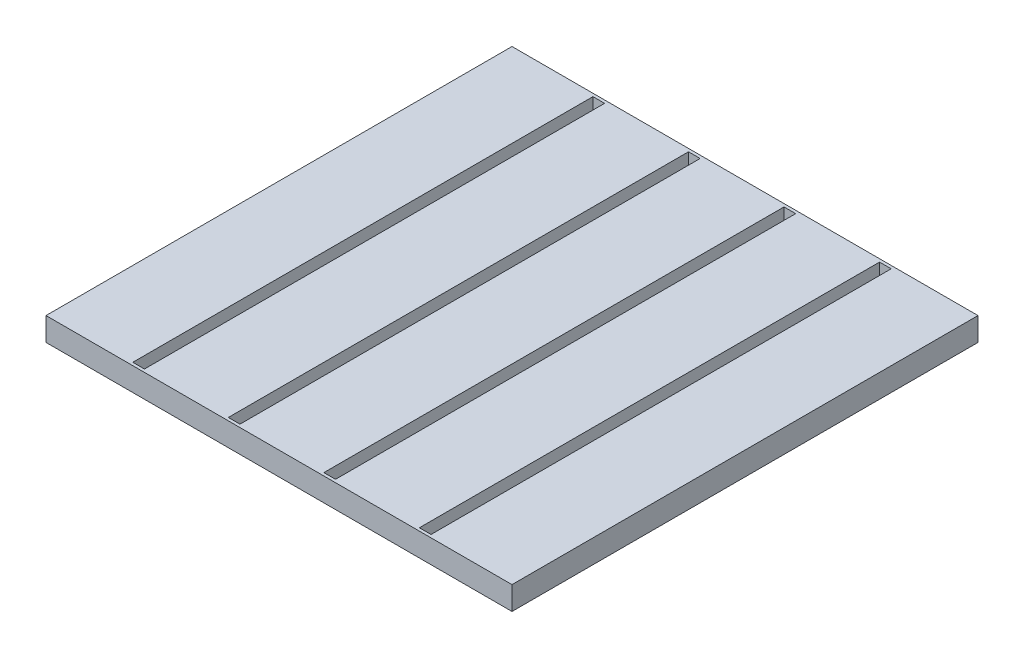
ISO-10303-21;
HEADER;
FILE_DESCRIPTION(('STEP AP214'),'2;1');
FILE_NAME('part.step','',(''),(''),'','','');
FILE_SCHEMA(('AUTOMOTIVE_DESIGN { 1 0 10303 214 1 1 1 1 }'));
ENDSEC;
DATA;
#1=APPLICATION_CONTEXT('core data for automotive mechanical design processes');
#2=APPLICATION_PROTOCOL_DEFINITION('international standard','automotive_design',2000,#1);
#3=PRODUCT_CONTEXT('',#1,'mechanical');
#4=PRODUCT('Part','Part','',(#3));
#5=PRODUCT_RELATED_PRODUCT_CATEGORY('part','',(#4));
#6=PRODUCT_DEFINITION_FORMATION('','',#4);
#7=PRODUCT_DEFINITION_CONTEXT('part definition',#1,'design');
#8=PRODUCT_DEFINITION('design','',#6,#7);
#9=PRODUCT_DEFINITION_SHAPE('','',#8);
#10=(LENGTH_UNIT() NAMED_UNIT(*) SI_UNIT(.MILLI.,.METRE.));
#11=(NAMED_UNIT(*) PLANE_ANGLE_UNIT() SI_UNIT($,.RADIAN.));
#12=(NAMED_UNIT(*) SI_UNIT($,.STERADIAN.) SOLID_ANGLE_UNIT());
#13=UNCERTAINTY_MEASURE_WITH_UNIT(LENGTH_MEASURE(1.E-05),#10,'distance_accuracy_value','');
#14=(GEOMETRIC_REPRESENTATION_CONTEXT(3) GLOBAL_UNCERTAINTY_ASSIGNED_CONTEXT((#13)) GLOBAL_UNIT_ASSIGNED_CONTEXT((#10,
#11,#12)) REPRESENTATION_CONTEXT('',''));
#15=CARTESIAN_POINT('',(0.,0.,0.));
#16=DIRECTION('',(0.,0.,1.));
#17=DIRECTION('',(1.,0.,0.));
#18=AXIS2_PLACEMENT_3D('',#15,#16,#17);
#19=CARTESIAN_POINT('',(0.,2.,0.));
#20=DIRECTION('',(0.,1.,0.));
#21=DIRECTION('',(0.,0.,1.));
#22=AXIS2_PLACEMENT_3D('',#19,#20,#21);
#23=PLANE('',#22);
#24=DIRECTION('',(0.,0.,1.));
#25=VECTOR('',#24,1.);
#26=CARTESIAN_POINT('',(0.,2.,0.));
#27=LINE('',#26,#25);
#28=CARTESIAN_POINT('',(0.,2.,0.));
#29=VERTEX_POINT('',#28);
#30=CARTESIAN_POINT('',(0.,2.,40.));
#31=VERTEX_POINT('',#30);
#32=EDGE_CURVE('E361',#29,#31,#27,.T.);
#33=ORIENTED_EDGE('',*,*,#32,.T.);
#34=DIRECTION('',(1.,0.,0.));
#35=VECTOR('',#34,1.);
#36=CARTESIAN_POINT('',(0.,2.,40.));
#37=LINE('',#36,#35);
#38=CARTESIAN_POINT('',(40.,2.,40.));
#39=VERTEX_POINT('',#38);
#40=EDGE_CURVE('E365',#31,#39,#37,.T.);
#41=ORIENTED_EDGE('',*,*,#40,.T.);
#42=DIRECTION('',(0.,0.,-1.));
#43=VECTOR('',#42,1.);
#44=CARTESIAN_POINT('',(40.,2.,0.));
#45=LINE('',#44,#43);
#46=CARTESIAN_POINT('',(40.,2.,0.));
#47=VERTEX_POINT('',#46);
#48=EDGE_CURVE('E369',#39,#47,#45,.T.);
#49=ORIENTED_EDGE('',*,*,#48,.T.);
#50=DIRECTION('',(-1.,0.,0.));
#51=VECTOR('',#50,1.);
#52=CARTESIAN_POINT('',(0.,2.,0.));
#53=LINE('',#52,#51);
#54=EDGE_CURVE('E372',#47,#29,#53,.T.);
#55=ORIENTED_EDGE('',*,*,#54,.T.);
#56=EDGE_LOOP('',(#33,#41,#49,#55));
#57=FACE_BOUND('',#56,.T.);
#58=DIRECTION('',(0.,0.,1.));
#59=VECTOR('',#58,1.);
#60=CARTESIAN_POINT('',(31.8,2.,0.25));
#61=LINE('',#60,#59);
#62=CARTESIAN_POINT('',(31.8,2.,0.25));
#63=VERTEX_POINT('',#62);
#64=CARTESIAN_POINT('',(31.8,2.,39.75));
#65=VERTEX_POINT('',#64);
#66=EDGE_CURVE('E333',#63,#65,#61,.T.);
#67=ORIENTED_EDGE('',*,*,#66,.F.);
#68=DIRECTION('',(1.,0.,0.));
#69=VECTOR('',#68,1.);
#70=CARTESIAN_POINT('',(31.8,2.,0.25));
#71=LINE('',#70,#69);
#72=CARTESIAN_POINT('',(32.8,2.,0.25));
#73=VERTEX_POINT('',#72);
#74=EDGE_CURVE('E279',#63,#73,#71,.T.);
#75=ORIENTED_EDGE('',*,*,#74,.T.);
#76=DIRECTION('',(0.,0.,1.));
#77=VECTOR('',#76,1.);
#78=CARTESIAN_POINT('',(32.8,2.,0.25));
#79=LINE('',#78,#77);
#80=CARTESIAN_POINT('',(32.8,2.,39.75));
#81=VERTEX_POINT('',#80);
#82=EDGE_CURVE('E342',#73,#81,#79,.T.);
#83=ORIENTED_EDGE('',*,*,#82,.T.);
#84=DIRECTION('',(1.,0.,0.));
#85=VECTOR('',#84,1.);
#86=CARTESIAN_POINT('',(31.8,2.,39.75));
#87=LINE('',#86,#85);
#88=EDGE_CURVE('E337',#65,#81,#87,.T.);
#89=ORIENTED_EDGE('',*,*,#88,.F.);
#90=EDGE_LOOP('',(#67,#75,#83,#89));
#91=FACE_BOUND('',#90,.T.);
#92=DIRECTION('',(0.,0.,1.));
#93=VECTOR('',#92,1.);
#94=CARTESIAN_POINT('',(23.6,2.,0.25));
#95=LINE('',#94,#93);
#96=CARTESIAN_POINT('',(23.6,2.,0.25));
#97=VERTEX_POINT('',#96);
#98=CARTESIAN_POINT('',(23.6,2.,39.75));
#99=VERTEX_POINT('',#98);
#100=EDGE_CURVE('E290',#97,#99,#95,.T.);
#101=ORIENTED_EDGE('',*,*,#100,.F.);
#102=DIRECTION('',(1.,0.,0.));
#103=VECTOR('',#102,1.);
#104=CARTESIAN_POINT('',(23.6,2.,0.25));
#105=LINE('',#104,#103);
#106=CARTESIAN_POINT('',(24.6,2.,0.25));
#107=VERTEX_POINT('',#106);
#108=EDGE_CURVE('E237',#97,#107,#105,.T.);
#109=ORIENTED_EDGE('',*,*,#108,.T.);
#110=DIRECTION('',(0.,0.,1.));
#111=VECTOR('',#110,1.);
#112=CARTESIAN_POINT('',(24.6,2.,0.25));
#113=LINE('',#112,#111);
#114=CARTESIAN_POINT('',(24.6,2.,39.75));
#115=VERTEX_POINT('',#114);
#116=EDGE_CURVE('E299',#107,#115,#113,.T.);
#117=ORIENTED_EDGE('',*,*,#116,.T.);
#118=DIRECTION('',(1.,0.,0.));
#119=VECTOR('',#118,1.);
#120=CARTESIAN_POINT('',(23.6,2.,39.75));
#121=LINE('',#120,#119);
#122=EDGE_CURVE('E294',#99,#115,#121,.T.);
#123=ORIENTED_EDGE('',*,*,#122,.F.);
#124=EDGE_LOOP('',(#101,#109,#117,#123));
#125=FACE_BOUND('',#124,.T.);
#126=DIRECTION('',(0.,0.,1.));
#127=VECTOR('',#126,1.);
#128=CARTESIAN_POINT('',(15.4,2.,0.25));
#129=LINE('',#128,#127);
#130=CARTESIAN_POINT('',(15.4,2.,0.25));
#131=VERTEX_POINT('',#130);
#132=CARTESIAN_POINT('',(15.4,2.,39.75));
#133=VERTEX_POINT('',#132);
#134=EDGE_CURVE('E247',#131,#133,#129,.T.);
#135=ORIENTED_EDGE('',*,*,#134,.F.);
#136=DIRECTION('',(1.,0.,0.));
#137=VECTOR('',#136,1.);
#138=CARTESIAN_POINT('',(15.4,2.,0.25));
#139=LINE('',#138,#137);
#140=CARTESIAN_POINT('',(16.4,2.,0.25));
#141=VERTEX_POINT('',#140);
#142=EDGE_CURVE('E67',#131,#141,#139,.T.);
#143=ORIENTED_EDGE('',*,*,#142,.T.);
#144=DIRECTION('',(0.,0.,1.));
#145=VECTOR('',#144,1.);
#146=CARTESIAN_POINT('',(16.4,2.,0.25));
#147=LINE('',#146,#145);
#148=CARTESIAN_POINT('',(16.4,2.,39.75));
#149=VERTEX_POINT('',#148);
#150=EDGE_CURVE('E256',#141,#149,#147,.T.);
#151=ORIENTED_EDGE('',*,*,#150,.T.);
#152=DIRECTION('',(1.,0.,0.));
#153=VECTOR('',#152,1.);
#154=CARTESIAN_POINT('',(15.4,2.,39.75));
#155=LINE('',#154,#153);
#156=EDGE_CURVE('E251',#133,#149,#155,.T.);
#157=ORIENTED_EDGE('',*,*,#156,.F.);
#158=EDGE_LOOP('',(#135,#143,#151,#157));
#159=FACE_BOUND('',#158,.T.);
#160=DIRECTION('',(1.,0.,0.));
#161=VECTOR('',#160,1.);
#162=CARTESIAN_POINT('',(0.,2.,0.25));
#163=LINE('',#162,#161);
#164=CARTESIAN_POINT('',(7.2,2.,0.25));
#165=VERTEX_POINT('',#164);
#166=CARTESIAN_POINT('',(8.2,2.,0.25));
#167=VERTEX_POINT('',#166);
#168=EDGE_CURVE('E218',#165,#167,#163,.T.);
#169=ORIENTED_EDGE('',*,*,#168,.T.);
#170=DIRECTION('',(0.,0.,1.));
#171=VECTOR('',#170,1.);
#172=CARTESIAN_POINT('',(8.2,2.,0.));
#173=LINE('',#172,#171);
#174=CARTESIAN_POINT('',(8.2,2.,39.75));
#175=VERTEX_POINT('',#174);
#176=EDGE_CURVE('E59',#167,#175,#173,.T.);
#177=ORIENTED_EDGE('',*,*,#176,.T.);
#178=DIRECTION('',(1.,0.,0.));
#179=VECTOR('',#178,1.);
#180=CARTESIAN_POINT('',(0.,2.,39.75));
#181=LINE('',#180,#179);
#182=CARTESIAN_POINT('',(7.2,2.,39.75));
#183=VERTEX_POINT('',#182);
#184=EDGE_CURVE('E205',#183,#175,#181,.T.);
#185=ORIENTED_EDGE('',*,*,#184,.F.);
#186=DIRECTION('',(0.,0.,1.));
#187=VECTOR('',#186,1.);
#188=CARTESIAN_POINT('',(7.2,2.,0.));
#189=LINE('',#188,#187);
#190=EDGE_CURVE('E209',#165,#183,#189,.T.);
#191=ORIENTED_EDGE('',*,*,#190,.F.);
#192=EDGE_LOOP('',(#169,#177,#185,#191));
#193=FACE_BOUND('',#192,.T.);
#194=ADVANCED_FACE('F43',(#57,#91,#125,#159,#193),#23,.T.);
#195=CARTESIAN_POINT('',(0.,0.,0.));
#196=DIRECTION('',(0.,1.,0.));
#197=DIRECTION('',(0.,0.,1.));
#198=AXIS2_PLACEMENT_3D('',#195,#196,#197);
#199=PLANE('',#198);
#200=DIRECTION('',(1.,0.,0.));
#201=VECTOR('',#200,1.);
#202=CARTESIAN_POINT('',(15.4,0.,0.25));
#203=LINE('',#202,#201);
#204=CARTESIAN_POINT('',(15.4,0.,0.25));
#205=VERTEX_POINT('',#204);
#206=CARTESIAN_POINT('',(16.4,0.,0.25));
#207=VERTEX_POINT('',#206);
#208=EDGE_CURVE('E252',#205,#207,#203,.T.);
#209=ORIENTED_EDGE('',*,*,#208,.F.);
#210=DIRECTION('',(0.,0.,1.));
#211=VECTOR('',#210,1.);
#212=CARTESIAN_POINT('',(15.4,0.,0.25));
#213=LINE('',#212,#211);
#214=CARTESIAN_POINT('',(15.4,0.,39.75));
#215=VERTEX_POINT('',#214);
#216=EDGE_CURVE('E246',#205,#215,#213,.T.);
#217=ORIENTED_EDGE('',*,*,#216,.T.);
#218=DIRECTION('',(1.,0.,0.));
#219=VECTOR('',#218,1.);
#220=CARTESIAN_POINT('',(15.4,0.,39.75));
#221=LINE('',#220,#219);
#222=CARTESIAN_POINT('',(16.4,0.,39.75));
#223=VERTEX_POINT('',#222);
#224=EDGE_CURVE('E265',#215,#223,#221,.T.);
#225=ORIENTED_EDGE('',*,*,#224,.T.);
#226=DIRECTION('',(0.,0.,1.));
#227=VECTOR('',#226,1.);
#228=CARTESIAN_POINT('',(16.4,0.,0.25));
#229=LINE('',#228,#227);
#230=EDGE_CURVE('E269',#207,#223,#229,.T.);
#231=ORIENTED_EDGE('',*,*,#230,.F.);
#232=EDGE_LOOP('',(#209,#217,#225,#231));
#233=FACE_BOUND('',#232,.T.);
#234=DIRECTION('',(1.,0.,0.));
#235=VECTOR('',#234,1.);
#236=CARTESIAN_POINT('',(31.8,0.,0.25));
#237=LINE('',#236,#235);
#238=CARTESIAN_POINT('',(31.8,0.,0.25));
#239=VERTEX_POINT('',#238);
#240=CARTESIAN_POINT('',(32.8,0.,0.25));
#241=VERTEX_POINT('',#240);
#242=EDGE_CURVE('E338',#239,#241,#237,.T.);
#243=ORIENTED_EDGE('',*,*,#242,.F.);
#244=DIRECTION('',(0.,0.,1.));
#245=VECTOR('',#244,1.);
#246=CARTESIAN_POINT('',(31.8,0.,0.25));
#247=LINE('',#246,#245);
#248=CARTESIAN_POINT('',(31.8,0.,39.75));
#249=VERTEX_POINT('',#248);
#250=EDGE_CURVE('E332',#239,#249,#247,.T.);
#251=ORIENTED_EDGE('',*,*,#250,.T.);
#252=DIRECTION('',(1.,0.,0.));
#253=VECTOR('',#252,1.);
#254=CARTESIAN_POINT('',(31.8,0.,39.75));
#255=LINE('',#254,#253);
#256=CARTESIAN_POINT('',(32.8,0.,39.75));
#257=VERTEX_POINT('',#256);
#258=EDGE_CURVE('E352',#249,#257,#255,.T.);
#259=ORIENTED_EDGE('',*,*,#258,.T.);
#260=DIRECTION('',(0.,0.,1.));
#261=VECTOR('',#260,1.);
#262=CARTESIAN_POINT('',(32.8,0.,0.25));
#263=LINE('',#262,#261);
#264=EDGE_CURVE('E356',#241,#257,#263,.T.);
#265=ORIENTED_EDGE('',*,*,#264,.F.);
#266=EDGE_LOOP('',(#243,#251,#259,#265));
#267=FACE_BOUND('',#266,.T.);
#268=DIRECTION('',(0.,0.,1.));
#269=VECTOR('',#268,1.);
#270=CARTESIAN_POINT('',(0.,0.,0.));
#271=LINE('',#270,#269);
#272=CARTESIAN_POINT('',(0.,0.,0.));
#273=VERTEX_POINT('',#272);
#274=CARTESIAN_POINT('',(0.,0.,40.));
#275=VERTEX_POINT('',#274);
#276=EDGE_CURVE('E227',#273,#275,#271,.T.);
#277=ORIENTED_EDGE('',*,*,#276,.F.);
#278=DIRECTION('',(-1.,0.,0.));
#279=VECTOR('',#278,1.);
#280=CARTESIAN_POINT('',(0.,0.,0.));
#281=LINE('',#280,#279);
#282=CARTESIAN_POINT('',(40.,0.,0.));
#283=VERTEX_POINT('',#282);
#284=EDGE_CURVE('E366',#283,#273,#281,.T.);
#285=ORIENTED_EDGE('',*,*,#284,.F.);
#286=DIRECTION('',(0.,0.,-1.));
#287=VECTOR('',#286,1.);
#288=CARTESIAN_POINT('',(40.,0.,0.));
#289=LINE('',#288,#287);
#290=CARTESIAN_POINT('',(40.,0.,40.));
#291=VERTEX_POINT('',#290);
#292=EDGE_CURVE('E382',#291,#283,#289,.T.);
#293=ORIENTED_EDGE('',*,*,#292,.F.);
#294=DIRECTION('',(1.,0.,0.));
#295=VECTOR('',#294,1.);
#296=CARTESIAN_POINT('',(0.,0.,40.));
#297=LINE('',#296,#295);
#298=EDGE_CURVE('E379',#275,#291,#297,.T.);
#299=ORIENTED_EDGE('',*,*,#298,.F.);
#300=EDGE_LOOP('',(#277,#285,#293,#299));
#301=FACE_BOUND('',#300,.T.);
#302=DIRECTION('',(1.,0.,0.));
#303=VECTOR('',#302,1.);
#304=CARTESIAN_POINT('',(23.6,0.,0.25));
#305=LINE('',#304,#303);
#306=CARTESIAN_POINT('',(23.6,0.,0.25));
#307=VERTEX_POINT('',#306);
#308=CARTESIAN_POINT('',(24.6,0.,0.25));
#309=VERTEX_POINT('',#308);
#310=EDGE_CURVE('E295',#307,#309,#305,.T.);
#311=ORIENTED_EDGE('',*,*,#310,.F.);
#312=DIRECTION('',(0.,0.,1.));
#313=VECTOR('',#312,1.);
#314=CARTESIAN_POINT('',(23.6,0.,0.25));
#315=LINE('',#314,#313);
#316=CARTESIAN_POINT('',(23.6,0.,39.75));
#317=VERTEX_POINT('',#316);
#318=EDGE_CURVE('E289',#307,#317,#315,.T.);
#319=ORIENTED_EDGE('',*,*,#318,.T.);
#320=DIRECTION('',(1.,0.,0.));
#321=VECTOR('',#320,1.);
#322=CARTESIAN_POINT('',(23.6,0.,39.75));
#323=LINE('',#322,#321);
#324=CARTESIAN_POINT('',(24.6,0.,39.75));
#325=VERTEX_POINT('',#324);
#326=EDGE_CURVE('E309',#317,#325,#323,.T.);
#327=ORIENTED_EDGE('',*,*,#326,.T.);
#328=DIRECTION('',(0.,0.,1.));
#329=VECTOR('',#328,1.);
#330=CARTESIAN_POINT('',(24.6,0.,0.25));
#331=LINE('',#330,#329);
#332=EDGE_CURVE('E313',#309,#325,#331,.T.);
#333=ORIENTED_EDGE('',*,*,#332,.F.);
#334=EDGE_LOOP('',(#311,#319,#327,#333));
#335=FACE_BOUND('',#334,.T.);
#336=DIRECTION('',(0.,0.,1.));
#337=VECTOR('',#336,1.);
#338=CARTESIAN_POINT('',(8.2,0.,0.));
#339=LINE('',#338,#337);
#340=CARTESIAN_POINT('',(8.2,0.,0.25));
#341=VERTEX_POINT('',#340);
#342=CARTESIAN_POINT('',(8.2,0.,39.75));
#343=VERTEX_POINT('',#342);
#344=EDGE_CURVE('E194',#341,#343,#339,.T.);
#345=ORIENTED_EDGE('',*,*,#344,.F.);
#346=DIRECTION('',(1.,0.,0.));
#347=VECTOR('',#346,1.);
#348=CARTESIAN_POINT('',(0.,0.,0.25));
#349=LINE('',#348,#347);
#350=CARTESIAN_POINT('',(7.2,0.,0.25));
#351=VERTEX_POINT('',#350);
#352=EDGE_CURVE('E183',#351,#341,#349,.T.);
#353=ORIENTED_EDGE('',*,*,#352,.F.);
#354=DIRECTION('',(0.,0.,1.));
#355=VECTOR('',#354,1.);
#356=CARTESIAN_POINT('',(7.2,0.,0.));
#357=LINE('',#356,#355);
#358=CARTESIAN_POINT('',(7.2,0.,39.75));
#359=VERTEX_POINT('',#358);
#360=EDGE_CURVE('E193',#351,#359,#357,.T.);
#361=ORIENTED_EDGE('',*,*,#360,.T.);
#362=DIRECTION('',(1.,0.,0.));
#363=VECTOR('',#362,1.);
#364=CARTESIAN_POINT('',(0.,0.,39.75));
#365=LINE('',#364,#363);
#366=EDGE_CURVE('E199',#359,#343,#365,.T.);
#367=ORIENTED_EDGE('',*,*,#366,.T.);
#368=EDGE_LOOP('',(#345,#353,#361,#367));
#369=FACE_BOUND('',#368,.T.);
#370=ADVANCED_FACE('F202',(#233,#267,#301,#335,#369),#199,.F.);
#371=CARTESIAN_POINT('',(0.,2.,0.));
#372=DIRECTION('',(1.,0.,0.));
#373=DIRECTION('',(0.,0.,-1.));
#374=AXIS2_PLACEMENT_3D('',#371,#372,#373);
#375=PLANE('',#374);
#376=ORIENTED_EDGE('',*,*,#276,.T.);
#377=DIRECTION('',(0.,-1.,0.));
#378=VECTOR('',#377,1.);
#379=CARTESIAN_POINT('',(0.,2.,40.));
#380=LINE('',#379,#378);
#381=EDGE_CURVE('E11',#31,#275,#380,.T.);
#382=ORIENTED_EDGE('',*,*,#381,.F.);
#383=ORIENTED_EDGE('',*,*,#32,.F.);
#384=DIRECTION('',(0.,-1.,0.));
#385=VECTOR('',#384,1.);
#386=CARTESIAN_POINT('',(0.,2.,0.));
#387=LINE('',#386,#385);
#388=EDGE_CURVE('E375',#29,#273,#387,.T.);
#389=ORIENTED_EDGE('',*,*,#388,.T.);
#390=EDGE_LOOP('',(#376,#382,#383,#389));
#391=FACE_BOUND('',#390,.T.);
#392=ADVANCED_FACE('F45',(#391),#375,.F.);
#393=CARTESIAN_POINT('',(0.,2.,40.));
#394=DIRECTION('',(0.,0.,-1.));
#395=DIRECTION('',(-1.,0.,0.));
#396=AXIS2_PLACEMENT_3D('',#393,#394,#395);
#397=PLANE('',#396);
#398=ORIENTED_EDGE('',*,*,#298,.T.);
#399=DIRECTION('',(0.,-1.,0.));
#400=VECTOR('',#399,1.);
#401=CARTESIAN_POINT('',(40.,2.,40.));
#402=LINE('',#401,#400);
#403=EDGE_CURVE('E52',#39,#291,#402,.T.);
#404=ORIENTED_EDGE('',*,*,#403,.F.);
#405=ORIENTED_EDGE('',*,*,#40,.F.);
#406=ORIENTED_EDGE('',*,*,#381,.T.);
#407=EDGE_LOOP('',(#398,#404,#405,#406));
#408=FACE_BOUND('',#407,.T.);
#409=ADVANCED_FACE('F415',(#408),#397,.F.);
#410=CARTESIAN_POINT('',(40.,2.,0.));
#411=DIRECTION('',(-1.,0.,0.));
#412=DIRECTION('',(0.,0.,1.));
#413=AXIS2_PLACEMENT_3D('',#410,#411,#412);
#414=PLANE('',#413);
#415=ORIENTED_EDGE('',*,*,#292,.T.);
#416=DIRECTION('',(0.,-1.,0.));
#417=VECTOR('',#416,1.);
#418=CARTESIAN_POINT('',(40.,2.,0.));
#419=LINE('',#418,#417);
#420=EDGE_CURVE('E390',#47,#283,#419,.T.);
#421=ORIENTED_EDGE('',*,*,#420,.F.);
#422=ORIENTED_EDGE('',*,*,#48,.F.);
#423=ORIENTED_EDGE('',*,*,#403,.T.);
#424=EDGE_LOOP('',(#415,#421,#422,#423));
#425=FACE_BOUND('',#424,.T.);
#426=ADVANCED_FACE('F399',(#425),#414,.F.);
#427=CARTESIAN_POINT('',(0.,2.,0.));
#428=DIRECTION('',(0.,0.,1.));
#429=DIRECTION('',(1.,0.,0.));
#430=AXIS2_PLACEMENT_3D('',#427,#428,#429);
#431=PLANE('',#430);
#432=ORIENTED_EDGE('',*,*,#284,.T.);
#433=ORIENTED_EDGE('',*,*,#388,.F.);
#434=ORIENTED_EDGE('',*,*,#54,.F.);
#435=ORIENTED_EDGE('',*,*,#420,.T.);
#436=EDGE_LOOP('',(#432,#433,#434,#435));
#437=FACE_BOUND('',#436,.T.);
#438=ADVANCED_FACE('F408',(#437),#431,.F.);
#439=CARTESIAN_POINT('',(31.8,0.,0.25));
#440=DIRECTION('',(0.,0.,1.));
#441=DIRECTION('',(1.,0.,0.));
#442=AXIS2_PLACEMENT_3D('',#439,#440,#441);
#443=PLANE('',#442);
#444=ORIENTED_EDGE('',*,*,#74,.F.);
#445=DIRECTION('',(0.,1.,0.));
#446=VECTOR('',#445,1.);
#447=CARTESIAN_POINT('',(31.8,0.,0.25));
#448=LINE('',#447,#446);
#449=EDGE_CURVE('E328',#239,#63,#448,.T.);
#450=ORIENTED_EDGE('',*,*,#449,.F.);
#451=ORIENTED_EDGE('',*,*,#242,.T.);
#452=DIRECTION('',(0.,1.,0.));
#453=VECTOR('',#452,1.);
#454=CARTESIAN_POINT('',(32.8,0.,0.25));
#455=LINE('',#454,#453);
#456=EDGE_CURVE('E318',#241,#73,#455,.T.);
#457=ORIENTED_EDGE('',*,*,#456,.T.);
#458=EDGE_LOOP('',(#444,#450,#451,#457));
#459=FACE_BOUND('',#458,.T.);
#460=ADVANCED_FACE('F434',(#459),#443,.T.);
#461=CARTESIAN_POINT('',(32.8,0.,0.25));
#462=DIRECTION('',(-1.,0.,0.));
#463=DIRECTION('',(0.,0.,1.));
#464=AXIS2_PLACEMENT_3D('',#461,#462,#463);
#465=PLANE('',#464);
#466=ORIENTED_EDGE('',*,*,#82,.F.);
#467=ORIENTED_EDGE('',*,*,#456,.F.);
#468=ORIENTED_EDGE('',*,*,#264,.T.);
#469=DIRECTION('',(0.,1.,0.));
#470=VECTOR('',#469,1.);
#471=CARTESIAN_POINT('',(32.8,0.,39.75));
#472=LINE('',#471,#470);
#473=EDGE_CURVE('E322',#257,#81,#472,.T.);
#474=ORIENTED_EDGE('',*,*,#473,.T.);
#475=EDGE_LOOP('',(#466,#467,#468,#474));
#476=FACE_BOUND('',#475,.T.);
#477=ADVANCED_FACE('F438',(#476),#465,.T.);
#478=CARTESIAN_POINT('',(31.8,0.,39.75));
#479=DIRECTION('',(0.,0.,1.));
#480=DIRECTION('',(1.,0.,0.));
#481=AXIS2_PLACEMENT_3D('',#478,#479,#480);
#482=PLANE('',#481);
#483=ORIENTED_EDGE('',*,*,#88,.T.);
#484=ORIENTED_EDGE('',*,*,#473,.F.);
#485=ORIENTED_EDGE('',*,*,#258,.F.);
#486=DIRECTION('',(0.,1.,0.));
#487=VECTOR('',#486,1.);
#488=CARTESIAN_POINT('',(31.8,0.,39.75));
#489=LINE('',#488,#487);
#490=EDGE_CURVE('E325',#249,#65,#489,.T.);
#491=ORIENTED_EDGE('',*,*,#490,.T.);
#492=EDGE_LOOP('',(#483,#484,#485,#491));
#493=FACE_BOUND('',#492,.T.);
#494=ADVANCED_FACE('F444',(#493),#482,.F.);
#495=CARTESIAN_POINT('',(31.8,0.,0.25));
#496=DIRECTION('',(-1.,0.,0.));
#497=DIRECTION('',(0.,0.,1.));
#498=AXIS2_PLACEMENT_3D('',#495,#496,#497);
#499=PLANE('',#498);
#500=ORIENTED_EDGE('',*,*,#66,.T.);
#501=ORIENTED_EDGE('',*,*,#490,.F.);
#502=ORIENTED_EDGE('',*,*,#250,.F.);
#503=ORIENTED_EDGE('',*,*,#449,.T.);
#504=EDGE_LOOP('',(#500,#501,#502,#503));
#505=FACE_BOUND('',#504,.T.);
#506=ADVANCED_FACE('F430',(#505),#499,.F.);
#507=CARTESIAN_POINT('',(23.6,0.,0.25));
#508=DIRECTION('',(0.,0.,1.));
#509=DIRECTION('',(1.,0.,0.));
#510=AXIS2_PLACEMENT_3D('',#507,#508,#509);
#511=PLANE('',#510);
#512=ORIENTED_EDGE('',*,*,#108,.F.);
#513=DIRECTION('',(0.,1.,0.));
#514=VECTOR('',#513,1.);
#515=CARTESIAN_POINT('',(23.6,0.,0.25));
#516=LINE('',#515,#514);
#517=EDGE_CURVE('E285',#307,#97,#516,.T.);
#518=ORIENTED_EDGE('',*,*,#517,.F.);
#519=ORIENTED_EDGE('',*,*,#310,.T.);
#520=DIRECTION('',(0.,1.,0.));
#521=VECTOR('',#520,1.);
#522=CARTESIAN_POINT('',(24.6,0.,0.25));
#523=LINE('',#522,#521);
#524=EDGE_CURVE('E274',#309,#107,#523,.T.);
#525=ORIENTED_EDGE('',*,*,#524,.T.);
#526=EDGE_LOOP('',(#512,#518,#519,#525));
#527=FACE_BOUND('',#526,.T.);
#528=ADVANCED_FACE('F455',(#527),#511,.T.);
#529=CARTESIAN_POINT('',(24.6,0.,0.25));
#530=DIRECTION('',(-1.,0.,0.));
#531=DIRECTION('',(0.,0.,1.));
#532=AXIS2_PLACEMENT_3D('',#529,#530,#531);
#533=PLANE('',#532);
#534=ORIENTED_EDGE('',*,*,#116,.F.);
#535=ORIENTED_EDGE('',*,*,#524,.F.);
#536=ORIENTED_EDGE('',*,*,#332,.T.);
#537=DIRECTION('',(0.,1.,0.));
#538=VECTOR('',#537,1.);
#539=CARTESIAN_POINT('',(24.6,0.,39.75));
#540=LINE('',#539,#538);
#541=EDGE_CURVE('E278',#325,#115,#540,.T.);
#542=ORIENTED_EDGE('',*,*,#541,.T.);
#543=EDGE_LOOP('',(#534,#535,#536,#542));
#544=FACE_BOUND('',#543,.T.);
#545=ADVANCED_FACE('F507',(#544),#533,.T.);
#546=CARTESIAN_POINT('',(23.6,0.,39.75));
#547=DIRECTION('',(0.,0.,1.));
#548=DIRECTION('',(1.,0.,0.));
#549=AXIS2_PLACEMENT_3D('',#546,#547,#548);
#550=PLANE('',#549);
#551=ORIENTED_EDGE('',*,*,#122,.T.);
#552=ORIENTED_EDGE('',*,*,#541,.F.);
#553=ORIENTED_EDGE('',*,*,#326,.F.);
#554=DIRECTION('',(0.,1.,0.));
#555=VECTOR('',#554,1.);
#556=CARTESIAN_POINT('',(23.6,0.,39.75));
#557=LINE('',#556,#555);
#558=EDGE_CURVE('E282',#317,#99,#557,.T.);
#559=ORIENTED_EDGE('',*,*,#558,.T.);
#560=EDGE_LOOP('',(#551,#552,#553,#559));
#561=FACE_BOUND('',#560,.T.);
#562=ADVANCED_FACE('F510',(#561),#550,.F.);
#563=CARTESIAN_POINT('',(23.6,0.,0.25));
#564=DIRECTION('',(-1.,0.,0.));
#565=DIRECTION('',(0.,0.,1.));
#566=AXIS2_PLACEMENT_3D('',#563,#564,#565);
#567=PLANE('',#566);
#568=ORIENTED_EDGE('',*,*,#100,.T.);
#569=ORIENTED_EDGE('',*,*,#558,.F.);
#570=ORIENTED_EDGE('',*,*,#318,.F.);
#571=ORIENTED_EDGE('',*,*,#517,.T.);
#572=EDGE_LOOP('',(#568,#569,#570,#571));
#573=FACE_BOUND('',#572,.T.);
#574=ADVANCED_FACE('F448',(#573),#567,.F.);
#575=CARTESIAN_POINT('',(15.4,0.,0.25));
#576=DIRECTION('',(0.,0.,1.));
#577=DIRECTION('',(1.,0.,0.));
#578=AXIS2_PLACEMENT_3D('',#575,#576,#577);
#579=PLANE('',#578);
#580=ORIENTED_EDGE('',*,*,#142,.F.);
#581=DIRECTION('',(0.,1.,0.));
#582=VECTOR('',#581,1.);
#583=CARTESIAN_POINT('',(15.4,0.,0.25));
#584=LINE('',#583,#582);
#585=EDGE_CURVE('E243',#205,#131,#584,.T.);
#586=ORIENTED_EDGE('',*,*,#585,.F.);
#587=ORIENTED_EDGE('',*,*,#208,.T.);
#588=DIRECTION('',(0.,1.,0.));
#589=VECTOR('',#588,1.);
#590=CARTESIAN_POINT('',(16.4,0.,0.25));
#591=LINE('',#590,#589);
#592=EDGE_CURVE('E233',#207,#141,#591,.T.);
#593=ORIENTED_EDGE('',*,*,#592,.T.);
#594=EDGE_LOOP('',(#580,#586,#587,#593));
#595=FACE_BOUND('',#594,.T.);
#596=ADVANCED_FACE('F491',(#595),#579,.T.);
#597=CARTESIAN_POINT('',(16.4,0.,0.25));
#598=DIRECTION('',(-1.,0.,0.));
#599=DIRECTION('',(0.,0.,1.));
#600=AXIS2_PLACEMENT_3D('',#597,#598,#599);
#601=PLANE('',#600);
#602=ORIENTED_EDGE('',*,*,#150,.F.);
#603=ORIENTED_EDGE('',*,*,#592,.F.);
#604=ORIENTED_EDGE('',*,*,#230,.T.);
#605=DIRECTION('',(0.,1.,0.));
#606=VECTOR('',#605,1.);
#607=CARTESIAN_POINT('',(16.4,0.,39.75));
#608=LINE('',#607,#606);
#609=EDGE_CURVE('E236',#223,#149,#608,.T.);
#610=ORIENTED_EDGE('',*,*,#609,.T.);
#611=EDGE_LOOP('',(#602,#603,#604,#610));
#612=FACE_BOUND('',#611,.T.);
#613=ADVANCED_FACE('F494',(#612),#601,.T.);
#614=CARTESIAN_POINT('',(15.4,0.,39.75));
#615=DIRECTION('',(0.,0.,1.));
#616=DIRECTION('',(1.,0.,0.));
#617=AXIS2_PLACEMENT_3D('',#614,#615,#616);
#618=PLANE('',#617);
#619=ORIENTED_EDGE('',*,*,#156,.T.);
#620=ORIENTED_EDGE('',*,*,#609,.F.);
#621=ORIENTED_EDGE('',*,*,#224,.F.);
#622=DIRECTION('',(0.,1.,0.));
#623=VECTOR('',#622,1.);
#624=CARTESIAN_POINT('',(15.4,0.,39.75));
#625=LINE('',#624,#623);
#626=EDGE_CURVE('E240',#215,#133,#625,.T.);
#627=ORIENTED_EDGE('',*,*,#626,.T.);
#628=EDGE_LOOP('',(#619,#620,#621,#627));
#629=FACE_BOUND('',#628,.T.);
#630=ADVANCED_FACE('F497',(#629),#618,.F.);
#631=CARTESIAN_POINT('',(15.4,0.,0.25));
#632=DIRECTION('',(-1.,0.,0.));
#633=DIRECTION('',(0.,0.,1.));
#634=AXIS2_PLACEMENT_3D('',#631,#632,#633);
#635=PLANE('',#634);
#636=ORIENTED_EDGE('',*,*,#134,.T.);
#637=ORIENTED_EDGE('',*,*,#626,.F.);
#638=ORIENTED_EDGE('',*,*,#216,.F.);
#639=ORIENTED_EDGE('',*,*,#585,.T.);
#640=EDGE_LOOP('',(#636,#637,#638,#639));
#641=FACE_BOUND('',#640,.T.);
#642=ADVANCED_FACE('F486',(#641),#635,.F.);
#643=CARTESIAN_POINT('',(8.2,0.,0.));
#644=DIRECTION('',(-1.,0.,0.));
#645=DIRECTION('',(0.,0.,1.));
#646=AXIS2_PLACEMENT_3D('',#643,#644,#645);
#647=PLANE('',#646);
#648=ORIENTED_EDGE('',*,*,#176,.F.);
#649=DIRECTION('',(0.,1.,0.));
#650=VECTOR('',#649,1.);
#651=CARTESIAN_POINT('',(8.2,0.,0.25));
#652=LINE('',#651,#650);
#653=EDGE_CURVE('E186',#341,#167,#652,.T.);
#654=ORIENTED_EDGE('',*,*,#653,.F.);
#655=ORIENTED_EDGE('',*,*,#344,.T.);
#656=DIRECTION('',(0.,1.,0.));
#657=VECTOR('',#656,1.);
#658=CARTESIAN_POINT('',(8.2,0.,39.75));
#659=LINE('',#658,#657);
#660=EDGE_CURVE('E224',#343,#175,#659,.T.);
#661=ORIENTED_EDGE('',*,*,#660,.T.);
#662=EDGE_LOOP('',(#648,#654,#655,#661));
#663=FACE_BOUND('',#662,.T.);
#664=ADVANCED_FACE('F196',(#663),#647,.T.);
#665=CARTESIAN_POINT('',(0.,0.,39.75));
#666=DIRECTION('',(0.,0.,1.));
#667=DIRECTION('',(1.,0.,0.));
#668=AXIS2_PLACEMENT_3D('',#665,#666,#667);
#669=PLANE('',#668);
#670=ORIENTED_EDGE('',*,*,#184,.T.);
#671=ORIENTED_EDGE('',*,*,#660,.F.);
#672=ORIENTED_EDGE('',*,*,#366,.F.);
#673=DIRECTION('',(0.,1.,0.));
#674=VECTOR('',#673,1.);
#675=CARTESIAN_POINT('',(7.2,0.,39.75));
#676=LINE('',#675,#674);
#677=EDGE_CURVE('E228',#359,#183,#676,.T.);
#678=ORIENTED_EDGE('',*,*,#677,.T.);
#679=EDGE_LOOP('',(#670,#671,#672,#678));
#680=FACE_BOUND('',#679,.T.);
#681=ADVANCED_FACE('F478',(#680),#669,.F.);
#682=CARTESIAN_POINT('',(7.2,0.,0.));
#683=DIRECTION('',(-1.,0.,0.));
#684=DIRECTION('',(0.,0.,1.));
#685=AXIS2_PLACEMENT_3D('',#682,#683,#684);
#686=PLANE('',#685);
#687=ORIENTED_EDGE('',*,*,#190,.T.);
#688=ORIENTED_EDGE('',*,*,#677,.F.);
#689=ORIENTED_EDGE('',*,*,#360,.F.);
#690=DIRECTION('',(0.,1.,0.));
#691=VECTOR('',#690,1.);
#692=CARTESIAN_POINT('',(7.2,0.,0.25));
#693=LINE('',#692,#691);
#694=EDGE_CURVE('E188',#351,#165,#693,.T.);
#695=ORIENTED_EDGE('',*,*,#694,.T.);
#696=EDGE_LOOP('',(#687,#688,#689,#695));
#697=FACE_BOUND('',#696,.T.);
#698=ADVANCED_FACE('F476',(#697),#686,.F.);
#699=CARTESIAN_POINT('',(0.,0.,0.25));
#700=DIRECTION('',(0.,0.,1.));
#701=DIRECTION('',(1.,0.,0.));
#702=AXIS2_PLACEMENT_3D('',#699,#700,#701);
#703=PLANE('',#702);
#704=ORIENTED_EDGE('',*,*,#168,.F.);
#705=ORIENTED_EDGE('',*,*,#694,.F.);
#706=ORIENTED_EDGE('',*,*,#352,.T.);
#707=ORIENTED_EDGE('',*,*,#653,.T.);
#708=EDGE_LOOP('',(#704,#705,#706,#707));
#709=FACE_BOUND('',#708,.T.);
#710=ADVANCED_FACE('F185',(#709),#703,.T.);
#711=CLOSED_SHELL('',(#194,#370,#392,#409,#426,#438,#460,#477,#494,#506,#528,#545,#562,#574,
#596,#613,#630,#642,#664,#681,#698,#710));
#712=MANIFOLD_SOLID_BREP('B2',#711);
#713=ADVANCED_BREP_SHAPE_REPRESENTATION('',(#18,#712),#14);
#714=SHAPE_DEFINITION_REPRESENTATION(#9,#713);
ENDSEC;
END-ISO-10303-21;
